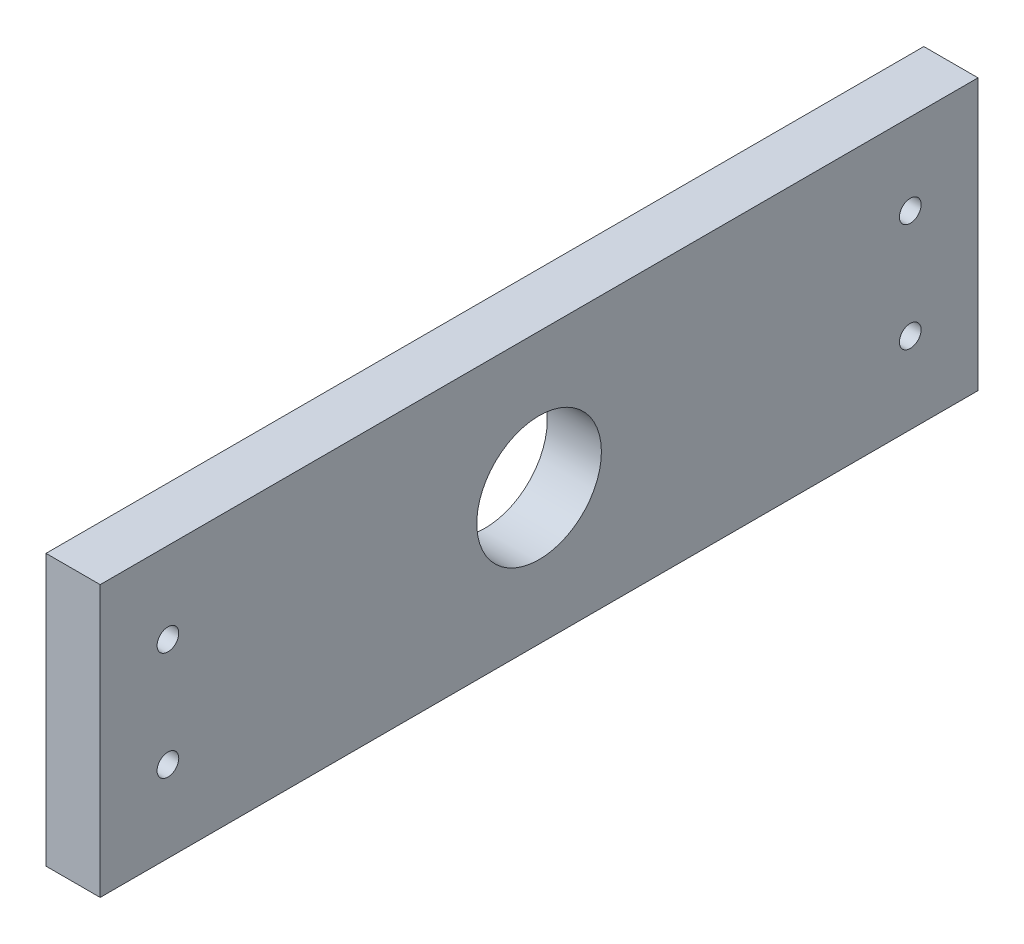
ISO-10303-21;
HEADER;
FILE_DESCRIPTION(('STEP AP214'),'2;1');
FILE_NAME('part.step','',(''),(''),'','','');
FILE_SCHEMA(('AUTOMOTIVE_DESIGN { 1 0 10303 214 1 1 1 1 }'));
ENDSEC;
DATA;
#1=APPLICATION_CONTEXT('core data for automotive mechanical design processes');
#2=APPLICATION_PROTOCOL_DEFINITION('international standard','automotive_design',2000,#1);
#3=PRODUCT_CONTEXT('',#1,'mechanical');
#4=PRODUCT('Part','Part','',(#3));
#5=PRODUCT_RELATED_PRODUCT_CATEGORY('part','',(#4));
#6=PRODUCT_DEFINITION_FORMATION('','',#4);
#7=PRODUCT_DEFINITION_CONTEXT('part definition',#1,'design');
#8=PRODUCT_DEFINITION('design','',#6,#7);
#9=PRODUCT_DEFINITION_SHAPE('','',#8);
#10=(LENGTH_UNIT() NAMED_UNIT(*) SI_UNIT(.MILLI.,.METRE.));
#11=(NAMED_UNIT(*) PLANE_ANGLE_UNIT() SI_UNIT($,.RADIAN.));
#12=(NAMED_UNIT(*) SI_UNIT($,.STERADIAN.) SOLID_ANGLE_UNIT());
#13=UNCERTAINTY_MEASURE_WITH_UNIT(LENGTH_MEASURE(1.E-05),#10,'distance_accuracy_value','');
#14=(GEOMETRIC_REPRESENTATION_CONTEXT(3) GLOBAL_UNCERTAINTY_ASSIGNED_CONTEXT((#13)) GLOBAL_UNIT_ASSIGNED_CONTEXT((#10,
#11,#12)) REPRESENTATION_CONTEXT('',''));
#15=CARTESIAN_POINT('',(0.,0.,0.));
#16=DIRECTION('',(0.,0.,1.));
#17=DIRECTION('',(1.,0.,0.));
#18=AXIS2_PLACEMENT_3D('',#15,#16,#17);
#19=CARTESIAN_POINT('',(10.,-25.,0.));
#20=DIRECTION('',(0.,1.,0.));
#21=DIRECTION('',(0.,0.,1.));
#22=AXIS2_PLACEMENT_3D('',#19,#20,#21);
#23=PLANE('',#22);
#24=DIRECTION('',(0.,0.,-1.));
#25=VECTOR('',#24,1.);
#26=CARTESIAN_POINT('',(0.,-25.,0.));
#27=LINE('',#26,#25);
#28=CARTESIAN_POINT('',(0.,-25.,81.));
#29=VERTEX_POINT('',#28);
#30=CARTESIAN_POINT('',(0.,-25.,-81.));
#31=VERTEX_POINT('',#30);
#32=EDGE_CURVE('E130',#29,#31,#27,.T.);
#33=ORIENTED_EDGE('',*,*,#32,.T.);
#34=DIRECTION('',(-1.,0.,0.));
#35=VECTOR('',#34,1.);
#36=CARTESIAN_POINT('',(10.,-25.,-81.));
#37=LINE('',#36,#35);
#38=CARTESIAN_POINT('',(10.,-25.,-81.));
#39=VERTEX_POINT('',#38);
#40=EDGE_CURVE('E11',#39,#31,#37,.T.);
#41=ORIENTED_EDGE('',*,*,#40,.F.);
#42=DIRECTION('',(0.,0.,-1.));
#43=VECTOR('',#42,1.);
#44=CARTESIAN_POINT('',(10.,-25.,0.));
#45=LINE('',#44,#43);
#46=CARTESIAN_POINT('',(10.,-25.,81.));
#47=VERTEX_POINT('',#46);
#48=EDGE_CURVE('E92',#47,#39,#45,.T.);
#49=ORIENTED_EDGE('',*,*,#48,.F.);
#50=DIRECTION('',(-1.,0.,0.));
#51=VECTOR('',#50,1.);
#52=CARTESIAN_POINT('',(10.,-25.,81.));
#53=LINE('',#52,#51);
#54=EDGE_CURVE('E58',#47,#29,#53,.T.);
#55=ORIENTED_EDGE('',*,*,#54,.T.);
#56=EDGE_LOOP('',(#33,#41,#49,#55));
#57=FACE_BOUND('',#56,.T.);
#58=ADVANCED_FACE('F41',(#57),#23,.F.);
#59=CARTESIAN_POINT('',(10.,0.,-81.));
#60=DIRECTION('',(0.,0.,1.));
#61=DIRECTION('',(1.,0.,0.));
#62=AXIS2_PLACEMENT_3D('',#59,#60,#61);
#63=PLANE('',#62);
#64=DIRECTION('',(0.,1.,0.));
#65=VECTOR('',#64,1.);
#66=CARTESIAN_POINT('',(0.,0.,-81.));
#67=LINE('',#66,#65);
#68=CARTESIAN_POINT('',(0.,25.,-81.));
#69=VERTEX_POINT('',#68);
#70=EDGE_CURVE('E98',#31,#69,#67,.T.);
#71=ORIENTED_EDGE('',*,*,#70,.T.);
#72=DIRECTION('',(-1.,0.,0.));
#73=VECTOR('',#72,1.);
#74=CARTESIAN_POINT('',(10.,25.,-81.));
#75=LINE('',#74,#73);
#76=CARTESIAN_POINT('',(10.,25.,-81.));
#77=VERTEX_POINT('',#76);
#78=EDGE_CURVE('E50',#77,#69,#75,.T.);
#79=ORIENTED_EDGE('',*,*,#78,.F.);
#80=DIRECTION('',(0.,1.,0.));
#81=VECTOR('',#80,1.);
#82=CARTESIAN_POINT('',(10.,0.,-81.));
#83=LINE('',#82,#81);
#84=EDGE_CURVE('E83',#39,#77,#83,.T.);
#85=ORIENTED_EDGE('',*,*,#84,.F.);
#86=ORIENTED_EDGE('',*,*,#40,.T.);
#87=EDGE_LOOP('',(#71,#79,#85,#86));
#88=FACE_BOUND('',#87,.T.);
#89=ADVANCED_FACE('F97',(#88),#63,.F.);
#90=CARTESIAN_POINT('',(10.,25.,0.));
#91=DIRECTION('',(0.,1.,0.));
#92=DIRECTION('',(0.,0.,1.));
#93=AXIS2_PLACEMENT_3D('',#90,#91,#92);
#94=PLANE('',#93);
#95=DIRECTION('',(0.,0.,-1.));
#96=VECTOR('',#95,1.);
#97=CARTESIAN_POINT('',(0.,25.,0.));
#98=LINE('',#97,#96);
#99=CARTESIAN_POINT('',(0.,25.,81.));
#100=VERTEX_POINT('',#99);
#101=EDGE_CURVE('E135',#100,#69,#98,.T.);
#102=ORIENTED_EDGE('',*,*,#101,.F.);
#103=DIRECTION('',(-1.,0.,0.));
#104=VECTOR('',#103,1.);
#105=CARTESIAN_POINT('',(10.,25.,81.));
#106=LINE('',#105,#104);
#107=CARTESIAN_POINT('',(10.,25.,81.));
#108=VERTEX_POINT('',#107);
#109=EDGE_CURVE('E72',#108,#100,#106,.T.);
#110=ORIENTED_EDGE('',*,*,#109,.F.);
#111=DIRECTION('',(0.,0.,-1.));
#112=VECTOR('',#111,1.);
#113=CARTESIAN_POINT('',(10.,25.,0.));
#114=LINE('',#113,#112);
#115=EDGE_CURVE('E91',#108,#77,#114,.T.);
#116=ORIENTED_EDGE('',*,*,#115,.T.);
#117=ORIENTED_EDGE('',*,*,#78,.T.);
#118=EDGE_LOOP('',(#102,#110,#116,#117));
#119=FACE_BOUND('',#118,.T.);
#120=ADVANCED_FACE('F102',(#119),#94,.T.);
#121=CARTESIAN_POINT('',(10.,-10.,68.5));
#122=DIRECTION('',(-1.,0.,0.));
#123=DIRECTION('',(0.,0.,1.));
#124=AXIS2_PLACEMENT_3D('',#121,#122,#123);
#125=CYLINDRICAL_SURFACE('',#124,2.);
#126=CARTESIAN_POINT('',(10.,-10.,68.5));
#127=DIRECTION('',(1.,0.,0.));
#128=DIRECTION('',(0.,0.,-1.));
#129=AXIS2_PLACEMENT_3D('',#126,#127,#128);
#130=CIRCLE('',#129,2.);
#131=CARTESIAN_POINT('',(10.,-10.,66.5));
#132=VERTEX_POINT('',#131);
#133=EDGE_CURVE('E122',#132,#132,#130,.T.);
#134=ORIENTED_EDGE('',*,*,#133,.T.);
#135=EDGE_LOOP('',(#134));
#136=FACE_BOUND('',#135,.T.);
#137=CARTESIAN_POINT('',(0.,-10.,68.5));
#138=DIRECTION('',(1.,0.,0.));
#139=DIRECTION('',(0.,0.,-1.));
#140=AXIS2_PLACEMENT_3D('',#137,#138,#139);
#141=CIRCLE('',#140,2.);
#142=CARTESIAN_POINT('',(0.,-10.,66.5));
#143=VERTEX_POINT('',#142);
#144=EDGE_CURVE('E154',#143,#143,#141,.T.);
#145=ORIENTED_EDGE('',*,*,#144,.F.);
#146=EDGE_LOOP('',(#145));
#147=FACE_BOUND('',#146,.T.);
#148=ADVANCED_FACE('F199',(#136,#147),#125,.F.);
#149=CARTESIAN_POINT('',(10.,0.,0.));
#150=DIRECTION('',(-1.,0.,0.));
#151=DIRECTION('',(0.,0.,1.));
#152=AXIS2_PLACEMENT_3D('',#149,#150,#151);
#153=CYLINDRICAL_SURFACE('',#152,11.5);
#154=CARTESIAN_POINT('',(10.,0.,0.));
#155=DIRECTION('',(1.,0.,0.));
#156=DIRECTION('',(0.,0.,-1.));
#157=AXIS2_PLACEMENT_3D('',#154,#155,#156);
#158=CIRCLE('',#157,11.5);
#159=CARTESIAN_POINT('',(10.,0.,-11.5));
#160=VERTEX_POINT('',#159);
#161=EDGE_CURVE('E118',#160,#160,#158,.T.);
#162=ORIENTED_EDGE('',*,*,#161,.T.);
#163=EDGE_LOOP('',(#162));
#164=FACE_BOUND('',#163,.T.);
#165=CARTESIAN_POINT('',(0.,0.,0.));
#166=DIRECTION('',(1.,0.,0.));
#167=DIRECTION('',(0.,0.,-1.));
#168=AXIS2_PLACEMENT_3D('',#165,#166,#167);
#169=CIRCLE('',#168,11.5);
#170=CARTESIAN_POINT('',(0.,0.,-11.5));
#171=VERTEX_POINT('',#170);
#172=EDGE_CURVE('E150',#171,#171,#169,.T.);
#173=ORIENTED_EDGE('',*,*,#172,.F.);
#174=EDGE_LOOP('',(#173));
#175=FACE_BOUND('',#174,.T.);
#176=ADVANCED_FACE('F203',(#164,#175),#153,.F.);
#177=CARTESIAN_POINT('',(10.,-9.99999999999998,-68.5));
#178=DIRECTION('',(-1.,0.,0.));
#179=DIRECTION('',(0.,0.,1.));
#180=AXIS2_PLACEMENT_3D('',#177,#178,#179);
#181=CYLINDRICAL_SURFACE('',#180,2.);
#182=CARTESIAN_POINT('',(10.,-9.99999999999998,-68.5));
#183=DIRECTION('',(1.,0.,0.));
#184=DIRECTION('',(0.,0.,-1.));
#185=AXIS2_PLACEMENT_3D('',#182,#183,#184);
#186=CIRCLE('',#185,2.);
#187=CARTESIAN_POINT('',(10.,-9.99999999999998,-70.5));
#188=VERTEX_POINT('',#187);
#189=EDGE_CURVE('E114',#188,#188,#186,.F.);
#190=ORIENTED_EDGE('',*,*,#189,.F.);
#191=EDGE_LOOP('',(#190));
#192=FACE_BOUND('',#191,.T.);
#193=CARTESIAN_POINT('',(0.,-9.99999999999998,-68.5));
#194=DIRECTION('',(1.,0.,0.));
#195=DIRECTION('',(0.,0.,-1.));
#196=AXIS2_PLACEMENT_3D('',#193,#194,#195);
#197=CIRCLE('',#196,2.);
#198=CARTESIAN_POINT('',(0.,-9.99999999999998,-70.5));
#199=VERTEX_POINT('',#198);
#200=EDGE_CURVE('E146',#199,#199,#197,.F.);
#201=ORIENTED_EDGE('',*,*,#200,.T.);
#202=EDGE_LOOP('',(#201));
#203=FACE_BOUND('',#202,.T.);
#204=ADVANCED_FACE('F193',(#192,#203),#181,.F.);
#205=CARTESIAN_POINT('',(10.,9.99999999999999,-68.5));
#206=DIRECTION('',(-1.,0.,0.));
#207=DIRECTION('',(0.,0.,1.));
#208=AXIS2_PLACEMENT_3D('',#205,#206,#207);
#209=CYLINDRICAL_SURFACE('',#208,2.);
#210=CARTESIAN_POINT('',(10.,9.99999999999999,-68.5));
#211=DIRECTION('',(1.,0.,0.));
#212=DIRECTION('',(0.,0.,-1.));
#213=AXIS2_PLACEMENT_3D('',#210,#211,#212);
#214=CIRCLE('',#213,2.);
#215=CARTESIAN_POINT('',(10.,9.99999999999999,-70.5));
#216=VERTEX_POINT('',#215);
#217=EDGE_CURVE('E107',#216,#216,#214,.T.);
#218=ORIENTED_EDGE('',*,*,#217,.T.);
#219=EDGE_LOOP('',(#218));
#220=FACE_BOUND('',#219,.T.);
#221=CARTESIAN_POINT('',(0.,9.99999999999999,-68.5));
#222=DIRECTION('',(1.,0.,0.));
#223=DIRECTION('',(0.,0.,-1.));
#224=AXIS2_PLACEMENT_3D('',#221,#222,#223);
#225=CIRCLE('',#224,2.);
#226=CARTESIAN_POINT('',(0.,9.99999999999999,-70.5));
#227=VERTEX_POINT('',#226);
#228=EDGE_CURVE('E142',#227,#227,#225,.T.);
#229=ORIENTED_EDGE('',*,*,#228,.F.);
#230=EDGE_LOOP('',(#229));
#231=FACE_BOUND('',#230,.T.);
#232=ADVANCED_FACE('F186',(#220,#231),#209,.F.);
#233=CARTESIAN_POINT('',(10.,0.,81.));
#234=DIRECTION('',(0.,0.,1.));
#235=DIRECTION('',(1.,0.,0.));
#236=AXIS2_PLACEMENT_3D('',#233,#234,#235);
#237=PLANE('',#236);
#238=DIRECTION('',(0.,1.,0.));
#239=VECTOR('',#238,1.);
#240=CARTESIAN_POINT('',(0.,0.,81.));
#241=LINE('',#240,#239);
#242=EDGE_CURVE('E138',#29,#100,#241,.T.);
#243=ORIENTED_EDGE('',*,*,#242,.F.);
#244=ORIENTED_EDGE('',*,*,#54,.F.);
#245=DIRECTION('',(0.,1.,0.));
#246=VECTOR('',#245,1.);
#247=CARTESIAN_POINT('',(10.,0.,81.));
#248=LINE('',#247,#246);
#249=EDGE_CURVE('E104',#47,#108,#248,.T.);
#250=ORIENTED_EDGE('',*,*,#249,.T.);
#251=ORIENTED_EDGE('',*,*,#109,.T.);
#252=EDGE_LOOP('',(#243,#244,#250,#251));
#253=FACE_BOUND('',#252,.T.);
#254=ADVANCED_FACE('F184',(#253),#237,.T.);
#255=CARTESIAN_POINT('',(10.,9.99999999999997,68.5));
#256=DIRECTION('',(-1.,0.,0.));
#257=DIRECTION('',(0.,0.,1.));
#258=AXIS2_PLACEMENT_3D('',#255,#256,#257);
#259=CYLINDRICAL_SURFACE('',#258,2.00000000000001);
#260=CARTESIAN_POINT('',(10.,9.99999999999997,68.5));
#261=DIRECTION('',(1.,0.,0.));
#262=DIRECTION('',(0.,0.,-1.));
#263=AXIS2_PLACEMENT_3D('',#260,#261,#262);
#264=CIRCLE('',#263,2.00000000000001);
#265=CARTESIAN_POINT('',(10.,9.99999999999997,66.5));
#266=VERTEX_POINT('',#265);
#267=EDGE_CURVE('E126',#266,#266,#264,.F.);
#268=ORIENTED_EDGE('',*,*,#267,.F.);
#269=EDGE_LOOP('',(#268));
#270=FACE_BOUND('',#269,.T.);
#271=CARTESIAN_POINT('',(0.,9.99999999999997,68.5));
#272=DIRECTION('',(1.,0.,0.));
#273=DIRECTION('',(0.,0.,-1.));
#274=AXIS2_PLACEMENT_3D('',#271,#272,#273);
#275=CIRCLE('',#274,2.00000000000001);
#276=CARTESIAN_POINT('',(0.,9.99999999999997,66.5));
#277=VERTEX_POINT('',#276);
#278=EDGE_CURVE('E158',#277,#277,#275,.F.);
#279=ORIENTED_EDGE('',*,*,#278,.T.);
#280=EDGE_LOOP('',(#279));
#281=FACE_BOUND('',#280,.T.);
#282=ADVANCED_FACE('F168',(#270,#281),#259,.F.);
#283=CARTESIAN_POINT('',(10.,0.,0.));
#284=DIRECTION('',(1.,0.,0.));
#285=DIRECTION('',(0.,0.,-1.));
#286=AXIS2_PLACEMENT_3D('',#283,#284,#285);
#287=PLANE('',#286);
#288=ORIENTED_EDGE('',*,*,#48,.T.);
#289=ORIENTED_EDGE('',*,*,#84,.T.);
#290=ORIENTED_EDGE('',*,*,#115,.F.);
#291=ORIENTED_EDGE('',*,*,#249,.F.);
#292=EDGE_LOOP('',(#288,#289,#290,#291));
#293=FACE_BOUND('',#292,.T.);
#294=ORIENTED_EDGE('',*,*,#217,.F.);
#295=EDGE_LOOP('',(#294));
#296=FACE_BOUND('',#295,.T.);
#297=ORIENTED_EDGE('',*,*,#189,.T.);
#298=EDGE_LOOP('',(#297));
#299=FACE_BOUND('',#298,.T.);
#300=ORIENTED_EDGE('',*,*,#161,.F.);
#301=EDGE_LOOP('',(#300));
#302=FACE_BOUND('',#301,.T.);
#303=ORIENTED_EDGE('',*,*,#133,.F.);
#304=EDGE_LOOP('',(#303));
#305=FACE_BOUND('',#304,.T.);
#306=ORIENTED_EDGE('',*,*,#267,.T.);
#307=EDGE_LOOP('',(#306));
#308=FACE_BOUND('',#307,.T.);
#309=ADVANCED_FACE('F87',(#293,#296,#299,#302,#305,#308),#287,.T.);
#310=CARTESIAN_POINT('',(0.,0.,0.));
#311=DIRECTION('',(1.,0.,0.));
#312=DIRECTION('',(0.,0.,-1.));
#313=AXIS2_PLACEMENT_3D('',#310,#311,#312);
#314=PLANE('',#313);
#315=ORIENTED_EDGE('',*,*,#32,.F.);
#316=ORIENTED_EDGE('',*,*,#242,.T.);
#317=ORIENTED_EDGE('',*,*,#101,.T.);
#318=ORIENTED_EDGE('',*,*,#70,.F.);
#319=EDGE_LOOP('',(#315,#316,#317,#318));
#320=FACE_BOUND('',#319,.T.);
#321=ORIENTED_EDGE('',*,*,#228,.T.);
#322=EDGE_LOOP('',(#321));
#323=FACE_BOUND('',#322,.T.);
#324=ORIENTED_EDGE('',*,*,#200,.F.);
#325=EDGE_LOOP('',(#324));
#326=FACE_BOUND('',#325,.T.);
#327=ORIENTED_EDGE('',*,*,#172,.T.);
#328=EDGE_LOOP('',(#327));
#329=FACE_BOUND('',#328,.T.);
#330=ORIENTED_EDGE('',*,*,#144,.T.);
#331=EDGE_LOOP('',(#330));
#332=FACE_BOUND('',#331,.T.);
#333=ORIENTED_EDGE('',*,*,#278,.F.);
#334=EDGE_LOOP('',(#333));
#335=FACE_BOUND('',#334,.T.);
#336=ADVANCED_FACE('F170',(#320,#323,#326,#329,#332,#335),#314,.F.);
#337=CLOSED_SHELL('',(#58,#89,#120,#148,#176,#204,#232,#254,#282,#309,#336));
#338=MANIFOLD_SOLID_BREP('B2',#337);
#339=ADVANCED_BREP_SHAPE_REPRESENTATION('',(#18,#338),#14);
#340=SHAPE_DEFINITION_REPRESENTATION(#9,#339);
ENDSEC;
END-ISO-10303-21;
